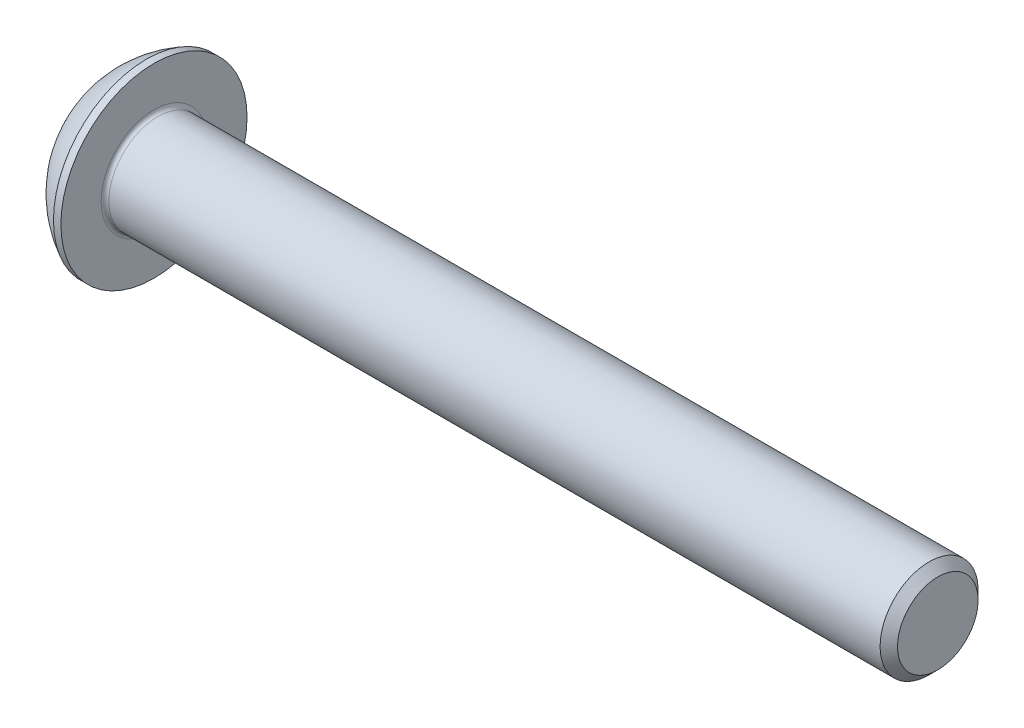
ISO-10303-21;
HEADER;
FILE_DESCRIPTION(('STEP AP214'),'2;1');
FILE_NAME('part.step','',(''),(''),'','','');
FILE_SCHEMA(('AUTOMOTIVE_DESIGN { 1 0 10303 214 1 1 1 1 }'));
ENDSEC;
DATA;
#1=APPLICATION_CONTEXT('core data for automotive mechanical design processes');
#2=APPLICATION_PROTOCOL_DEFINITION('international standard','automotive_design',2000,#1);
#3=PRODUCT_CONTEXT('',#1,'mechanical');
#4=PRODUCT('Part','Part','',(#3));
#5=PRODUCT_RELATED_PRODUCT_CATEGORY('part','',(#4));
#6=PRODUCT_DEFINITION_FORMATION('','',#4);
#7=PRODUCT_DEFINITION_CONTEXT('part definition',#1,'design');
#8=PRODUCT_DEFINITION('design','',#6,#7);
#9=PRODUCT_DEFINITION_SHAPE('','',#8);
#10=(LENGTH_UNIT() NAMED_UNIT(*) SI_UNIT(.MILLI.,.METRE.));
#11=(NAMED_UNIT(*) PLANE_ANGLE_UNIT() SI_UNIT($,.RADIAN.));
#12=(NAMED_UNIT(*) SI_UNIT($,.STERADIAN.) SOLID_ANGLE_UNIT());
#13=UNCERTAINTY_MEASURE_WITH_UNIT(LENGTH_MEASURE(1.E-05),#10,'distance_accuracy_value','');
#14=(GEOMETRIC_REPRESENTATION_CONTEXT(3) GLOBAL_UNCERTAINTY_ASSIGNED_CONTEXT((#13)) GLOBAL_UNIT_ASSIGNED_CONTEXT((#10,
#11,#12)) REPRESENTATION_CONTEXT('',''));
#15=CARTESIAN_POINT('',(0.,0.,0.));
#16=DIRECTION('',(0.,0.,1.));
#17=DIRECTION('',(1.,0.,0.));
#18=AXIS2_PLACEMENT_3D('',#15,#16,#17);
#19=CARTESIAN_POINT('',(0.,0.,0.));
#20=DIRECTION('',(-1.,0.,0.));
#21=DIRECTION('',(0.,0.,1.));
#22=AXIS2_PLACEMENT_3D('',#19,#20,#21);
#23=PLANE('',#22);
#24=CARTESIAN_POINT('',(0.,0.,0.));
#25=DIRECTION('',(-1.,0.,0.));
#26=DIRECTION('',(0.,0.,1.));
#27=AXIS2_PLACEMENT_3D('',#24,#25,#26);
#28=CIRCLE('',#27,2.375);
#29=CARTESIAN_POINT('',(0.,2.375,0.));
#30=VERTEX_POINT('',#29);
#31=EDGE_CURVE('E157',#30,#30,#28,.T.);
#32=ORIENTED_EDGE('',*,*,#31,.T.);
#33=EDGE_LOOP('',(#32));
#34=FACE_BOUND('',#33,.T.);
#35=DIRECTION('',(0.,-1.,0.));
#36=VECTOR('',#35,1.);
#37=CARTESIAN_POINT('',(0.,-0.866025403784438,1.5));
#38=LINE('',#37,#36);
#39=CARTESIAN_POINT('',(0.,0.866025403784439,1.5));
#40=VERTEX_POINT('',#39);
#41=CARTESIAN_POINT('',(0.,-0.866025403784438,1.5));
#42=VERTEX_POINT('',#41);
#43=EDGE_CURVE('E52',#40,#42,#38,.T.);
#44=ORIENTED_EDGE('',*,*,#43,.T.);
#45=DIRECTION('',(0.,-0.500000000000001,-0.866025403784438));
#46=VECTOR('',#45,1.);
#47=CARTESIAN_POINT('',(0.,-1.73205080756888,0.));
#48=LINE('',#47,#46);
#49=CARTESIAN_POINT('',(0.,-1.73205080756888,0.));
#50=VERTEX_POINT('',#49);
#51=EDGE_CURVE('E277',#42,#50,#48,.T.);
#52=ORIENTED_EDGE('',*,*,#51,.T.);
#53=DIRECTION('',(0.,0.500000000000001,-0.866025403784438));
#54=VECTOR('',#53,1.);
#55=CARTESIAN_POINT('',(0.,-0.866025403784438,-1.5));
#56=LINE('',#55,#54);
#57=CARTESIAN_POINT('',(0.,-0.866025403784438,-1.5));
#58=VERTEX_POINT('',#57);
#59=EDGE_CURVE('E132',#50,#58,#56,.T.);
#60=ORIENTED_EDGE('',*,*,#59,.T.);
#61=DIRECTION('',(0.,1.,0.));
#62=VECTOR('',#61,1.);
#63=CARTESIAN_POINT('',(0.,0.866025403784439,-1.5));
#64=LINE('',#63,#62);
#65=CARTESIAN_POINT('',(0.,0.866025403784439,-1.5));
#66=VERTEX_POINT('',#65);
#67=EDGE_CURVE('E280',#58,#66,#64,.T.);
#68=ORIENTED_EDGE('',*,*,#67,.T.);
#69=DIRECTION('',(0.,0.5,0.866025403784439));
#70=VECTOR('',#69,1.);
#71=CARTESIAN_POINT('',(0.,1.73205080756888,0.));
#72=LINE('',#71,#70);
#73=CARTESIAN_POINT('',(0.,1.73205080756888,0.));
#74=VERTEX_POINT('',#73);
#75=EDGE_CURVE('E282',#66,#74,#72,.T.);
#76=ORIENTED_EDGE('',*,*,#75,.T.);
#77=DIRECTION('',(0.,-0.5,0.866025403784439));
#78=VECTOR('',#77,1.);
#79=CARTESIAN_POINT('',(0.,0.866025403784439,1.5));
#80=LINE('',#79,#78);
#81=EDGE_CURVE('E284',#74,#40,#80,.T.);
#82=ORIENTED_EDGE('',*,*,#81,.T.);
#83=EDGE_LOOP('',(#44,#52,#60,#68,#76,#82));
#84=FACE_BOUND('',#83,.T.);
#85=ADVANCED_FACE('F37',(#34,#84),#23,.T.);
#86=CARTESIAN_POINT('',(4.75501582278481,0.,0.));
#87=DIRECTION('',(-1.,0.,0.));
#88=DIRECTION('',(0.,1.,0.));
#89=AXIS2_PLACEMENT_3D('',#86,#87,#88);
#90=SPHERICAL_SURFACE('',#89,5.3151482081814);
#91=CARTESIAN_POINT('',(2.37,0.,0.));
#92=DIRECTION('',(-1.,0.,0.));
#93=DIRECTION('',(0.,0.,1.));
#94=AXIS2_PLACEMENT_3D('',#91,#92,#93);
#95=CIRCLE('',#94,4.75);
#96=CARTESIAN_POINT('',(2.37,4.75,0.));
#97=VERTEX_POINT('',#96);
#98=EDGE_CURVE('E154',#97,#97,#95,.T.);
#99=CARTESIAN_POINT('',(2.37,4.75,0.));
#100=CARTESIAN_POINT('',(2.33822259048669,4.73404434732511,0.));
#101=CARTESIAN_POINT('',(2.30660534291523,4.71776971995817,0.));
#102=CARTESIAN_POINT('',(2.24370380094997,4.68458927158339,0.));
#103=CARTESIAN_POINT('',(2.21241950655618,4.66768345057555,0.));
#104=CARTESIAN_POINT('',(2.15019650024021,4.6332473706621,0.));
#105=CARTESIAN_POINT('',(2.11925778831804,4.6157171117565,0.));
#106=CARTESIAN_POINT('',(2.05773840110808,4.58003923142985,0.));
#107=CARTESIAN_POINT('',(2.02715772582028,4.56189161000879,0.));
#108=CARTESIAN_POINT('',(1.96636673145741,4.52498631044657,0.));
#109=CARTESIAN_POINT('',(1.93615641238234,4.50622863230542,0.));
#110=CARTESIAN_POINT('',(1.87611829826807,4.46811077571318,0.));
#111=CARTESIAN_POINT('',(1.84629050322887,4.4487505972621,0.));
#112=CARTESIAN_POINT('',(1.78702945162455,4.40943553782984,0.));
#113=CARTESIAN_POINT('',(1.75759619505941,4.38948065684866,0.));
#114=CARTESIAN_POINT('',(1.69913607574061,4.34898423002648,0.));
#115=CARTESIAN_POINT('',(1.67010921298694,4.32844268418549,0.));
#116=CARTESIAN_POINT('',(1.61247357298735,4.28678120152175,0.));
#117=CARTESIAN_POINT('',(1.58386479574144,4.265661264699,0.));
#118=CARTESIAN_POINT('',(1.52707685004032,4.22285150694424,0.));
#119=CARTESIAN_POINT('',(1.49889768158512,4.20116168601223,0.));
#120=CARTESIAN_POINT('',(1.44298030371049,4.15722089644741,0.));
#121=CARTESIAN_POINT('',(1.41524209429107,4.13496992781461,0.));
#122=CARTESIAN_POINT('',(1.36021780711889,4.08991580528235,0.));
#123=CARTESIAN_POINT('',(1.33293172936613,4.06711265138288,0.));
#124=CARTESIAN_POINT('',(1.278822696045,4.02096334316478,0.));
#125=CARTESIAN_POINT('',(1.25199974047662,3.99761718884614,0.));
#126=CARTESIAN_POINT('',(1.19882775550162,3.95039128335163,0.));
#127=CARTESIAN_POINT('',(1.172478726095,3.92651153217576,0.));
#128=CARTESIAN_POINT('',(1.1202652065289,3.87822805145535,0.));
#129=CARTESIAN_POINT('',(1.09440071636942,3.85382432191081,0.));
#130=CARTESIAN_POINT('',(1.04316669321618,3.8045027139941,0.));
#131=CARTESIAN_POINT('',(1.01779716022241,3.77958483562192,0.));
#132=CARTESIAN_POINT('',(0.9675632699561,3.72924496668416,0.));
#133=CARTESIAN_POINT('',(0.942698912683562,3.70382297611859,0.));
#134=CARTESIAN_POINT('',(0.893485388936279,3.65248512247887,0.));
#135=CARTESIAN_POINT('',(0.869136222461535,3.62656925940472,0.));
#136=CARTESIAN_POINT('',(0.820962887873489,3.57425409935885,0.));
#137=CARTESIAN_POINT('',(0.797138719760188,3.54785480238711,0.));
#138=CARTESIAN_POINT('',(0.750024977995378,3.49458340787865,0.));
#139=CARTESIAN_POINT('',(0.726735404343869,3.46771131034191,0.));
#140=CARTESIAN_POINT('',(0.68070023227454,3.41350513847464,0.));
#141=CARTESIAN_POINT('',(0.657954633856721,3.3861710641441,0.));
#142=CARTESIAN_POINT('',(0.613016573919582,3.33105194853939,0.));
#143=CARTESIAN_POINT('',(0.590824112400263,3.30326690726522,0.));
#144=CARTESIAN_POINT('',(0.547001265128254,3.24725704926748,0.));
#145=CARTESIAN_POINT('',(0.525370879375564,3.21903223254391,0.));
#146=CARTESIAN_POINT('',(0.482680896105488,3.16215419227902,0.));
#147=CARTESIAN_POINT('',(0.461621298588104,3.13350096873769,0.));
#148=CARTESIAN_POINT('',(0.420081374357153,3.07577765602273,0.));
#149=CARTESIAN_POINT('',(0.399601047643587,3.04670756684908,0.));
#150=CARTESIAN_POINT('',(0.359227914239947,2.98816223197683,0.));
#151=CARTESIAN_POINT('',(0.339335107549873,2.95868698627822,0.));
#152=CARTESIAN_POINT('',(0.300145026860787,2.89934321060632,0.));
#153=CARTESIAN_POINT('',(0.280847752861776,2.86947468063304,0.));
#154=CARTESIAN_POINT('',(0.24285650999714,2.80935636725696,0.));
#155=CARTESIAN_POINT('',(0.224162541131515,2.77910658385417,0.));
#156=CARTESIAN_POINT('',(0.187385439283607,2.71823794734018,0.));
#157=CARTESIAN_POINT('',(0.169302306301324,2.68761909422898,0.));
#158=CARTESIAN_POINT('',(0.133754156035988,2.626024653246,0.));
#159=CARTESIAN_POINT('',(0.116289138752934,2.59504906537422,0.));
#160=CARTESIAN_POINT('',(0.081984269005742,2.53275362391635,0.));
#161=CARTESIAN_POINT('',(0.0651444165416036,2.50143377033028,0.));
#162=CARTESIAN_POINT('',(0.0320966055444289,2.43846244094735,0.));
#163=CARTESIAN_POINT('',(0.0158886470113927,2.40681096515049,0.));
#164=CARTESIAN_POINT('',(0.,2.375,0.));
#165=B_SPLINE_CURVE_WITH_KNOTS('',3,(#99,#100,#101,#102,#103,#104,#105,#106,#107,#108,#109,#110,
#111,#112,#113,#114,#115,#116,#117,#118,#119,#120,#121,#122,#123,#124,#125,#126,#127,#128,#129,
#130,#131,#132,#133,#134,#135,#136,#137,#138,#139,#140,#141,#142,#143,#144,#145,#146,#147,#148,
#149,#150,#151,#152,#153,#154,#155,#156,#157,#158,#159,#160,#161,#162,#163,#164),.UNSPECIFIED.,
.F.,.F.,(4,2,2,2,2,2,2,2,2,2,2,2,2,2,2,2,2,2,2,2,2,2,2,2,2,2,2,2,2,2,2,2,4),(0.,
0.106672849678272,0.213345699356545,0.320018549034817,0.42669139871309,0.533364248391363,
0.640037098069635,0.746709947747908,0.85338279742618,0.960055647104452,1.06672849678273,
1.173401346461,1.28007419613927,1.38674704581754,1.49341989549582,1.60009274517409,
1.70676559485236,1.81343844453063,1.9201112942089,2.02678414388718,2.13345699356545,
2.24012984324372,2.346802692922,2.45347554260027,2.56014839227854,2.66682124195681,
2.77349409163509,2.88016694131336,2.98683979099163,3.0935126406699,3.20018549034817,
3.30685834002645,3.41353118970472),.UNSPECIFIED.);
#166=EDGE_CURVE('BSEAM178',#97,#30,#165,.T.);
#167=ORIENTED_EDGE('',*,*,#98,.T.);
#168=ORIENTED_EDGE('',*,*,#31,.F.);
#169=ORIENTED_EDGE('',*,*,#166,.T.);
#170=ORIENTED_EDGE('',*,*,#166,.F.);
#171=EDGE_LOOP('',(#167,#169,#168,#170));
#172=FACE_BOUND('',#171,.T.);
#173=ADVANCED_FACE('F178',(#172),#90,.T.);
#174=CARTESIAN_POINT('',(0.,0.,0.));
#175=DIRECTION('',(-1.,0.,0.));
#176=DIRECTION('',(0.,0.,1.));
#177=AXIS2_PLACEMENT_3D('',#174,#175,#176);
#178=CYLINDRICAL_SURFACE('',#177,4.75);
#179=ORIENTED_EDGE('',*,*,#98,.F.);
#180=EDGE_LOOP('',(#179));
#181=FACE_BOUND('',#180,.T.);
#182=CARTESIAN_POINT('',(2.75,0.,0.));
#183=DIRECTION('',(-1.,0.,0.));
#184=DIRECTION('',(0.,0.,1.));
#185=AXIS2_PLACEMENT_3D('',#182,#183,#184);
#186=CIRCLE('',#185,4.75);
#187=CARTESIAN_POINT('',(2.75,0.,4.75));
#188=VERTEX_POINT('',#187);
#189=EDGE_CURVE('E151',#188,#188,#186,.T.);
#190=ORIENTED_EDGE('',*,*,#189,.T.);
#191=EDGE_LOOP('',(#190));
#192=FACE_BOUND('',#191,.T.);
#193=ADVANCED_FACE('F183',(#181,#192),#178,.T.);
#194=CARTESIAN_POINT('',(2.75,2.5,0.));
#195=DIRECTION('',(-1.,0.,0.));
#196=DIRECTION('',(0.,0.,1.));
#197=AXIS2_PLACEMENT_3D('',#194,#195,#196);
#198=PLANE('',#197);
#199=CARTESIAN_POINT('',(2.75,0.,0.));
#200=DIRECTION('',(-1.,0.,0.));
#201=DIRECTION('',(0.,0.,1.));
#202=AXIS2_PLACEMENT_3D('',#199,#200,#201);
#203=CIRCLE('',#202,2.7);
#204=CARTESIAN_POINT('',(2.75,0.,2.7));
#205=VERTEX_POINT('',#204);
#206=EDGE_CURVE('E45',#205,#205,#203,.T.);
#207=ORIENTED_EDGE('',*,*,#206,.T.);
#208=EDGE_LOOP('',(#207));
#209=FACE_BOUND('',#208,.T.);
#210=ORIENTED_EDGE('',*,*,#189,.F.);
#211=EDGE_LOOP('',(#210));
#212=FACE_BOUND('',#211,.T.);
#213=ADVANCED_FACE('F162',(#209,#212),#198,.F.);
#214=CARTESIAN_POINT('',(0.,0.,0.));
#215=DIRECTION('',(-1.,0.,0.));
#216=DIRECTION('',(0.,0.,1.));
#217=AXIS2_PLACEMENT_3D('',#214,#215,#216);
#218=CYLINDRICAL_SURFACE('',#217,2.5);
#219=CARTESIAN_POINT('',(2.95,0.,0.));
#220=DIRECTION('',(-1.,0.,0.));
#221=DIRECTION('',(0.,0.,1.));
#222=AXIS2_PLACEMENT_3D('',#219,#220,#221);
#223=CIRCLE('',#222,2.5);
#224=CARTESIAN_POINT('',(2.95,0.,2.5));
#225=VERTEX_POINT('',#224);
#226=EDGE_CURVE('E11',#225,#225,#223,.F.);
#227=ORIENTED_EDGE('',*,*,#226,.T.);
#228=EDGE_LOOP('',(#227));
#229=FACE_BOUND('',#228,.T.);
#230=CARTESIAN_POINT('',(42.305,0.,0.));
#231=DIRECTION('',(-1.,0.,0.));
#232=DIRECTION('',(0.,0.,1.));
#233=AXIS2_PLACEMENT_3D('',#230,#231,#232);
#234=CIRCLE('',#233,2.5);
#235=CARTESIAN_POINT('',(42.305,0.,2.5));
#236=VERTEX_POINT('',#235);
#237=EDGE_CURVE('E148',#236,#236,#234,.T.);
#238=ORIENTED_EDGE('',*,*,#237,.T.);
#239=EDGE_LOOP('',(#238));
#240=FACE_BOUND('',#239,.T.);
#241=ADVANCED_FACE('F192',(#229,#240),#218,.T.);
#242=CARTESIAN_POINT('',(42.75,0.,0.));
#243=DIRECTION('',(-1.,0.,0.));
#244=DIRECTION('',(0.,0.,1.));
#245=AXIS2_PLACEMENT_3D('',#242,#243,#244);
#246=CONICAL_SURFACE('',#245,2.055,0.785398163397441);
#247=ORIENTED_EDGE('',*,*,#237,.F.);
#248=EDGE_LOOP('',(#247));
#249=FACE_BOUND('',#248,.T.);
#250=CARTESIAN_POINT('',(42.75,0.,0.));
#251=DIRECTION('',(-1.,0.,0.));
#252=DIRECTION('',(0.,0.,1.));
#253=AXIS2_PLACEMENT_3D('',#250,#251,#252);
#254=CIRCLE('',#253,2.055);
#255=CARTESIAN_POINT('',(42.75,0.,2.055));
#256=VERTEX_POINT('',#255);
#257=EDGE_CURVE('E144',#256,#256,#254,.T.);
#258=ORIENTED_EDGE('',*,*,#257,.T.);
#259=EDGE_LOOP('',(#258));
#260=FACE_BOUND('',#259,.T.);
#261=ADVANCED_FACE('F173',(#249,#260),#246,.T.);
#262=CARTESIAN_POINT('',(42.75,0.,0.));
#263=DIRECTION('',(-1.,0.,0.));
#264=DIRECTION('',(0.,0.,1.));
#265=AXIS2_PLACEMENT_3D('',#262,#263,#264);
#266=PLANE('',#265);
#267=ORIENTED_EDGE('',*,*,#257,.F.);
#268=EDGE_LOOP('',(#267));
#269=FACE_BOUND('',#268,.T.);
#270=ADVANCED_FACE('F166',(#269),#266,.F.);
#271=CARTESIAN_POINT('',(2.95,0.,0.));
#272=DIRECTION('',(-1.,0.,0.));
#273=DIRECTION('',(0.,0.,1.));
#274=AXIS2_PLACEMENT_3D('',#271,#272,#273);
#275=TOROIDAL_SURFACE('',#274,2.7,0.2);
#276=ORIENTED_EDGE('',*,*,#226,.F.);
#277=EDGE_LOOP('',(#276));
#278=FACE_BOUND('',#277,.T.);
#279=ORIENTED_EDGE('',*,*,#206,.F.);
#280=EDGE_LOOP('',(#279));
#281=FACE_BOUND('',#280,.T.);
#282=ADVANCED_FACE('F39',(#278,#281),#275,.F.);
#283=CARTESIAN_POINT('',(1.56,-1.73205080756888,0.));
#284=DIRECTION('',(0.,0.866025403784438,-0.500000000000001));
#285=DIRECTION('',(0.,0.500000000000001,0.866025403784438));
#286=AXIS2_PLACEMENT_3D('',#283,#284,#285);
#287=PLANE('',#286);
#288=DIRECTION('',(0.,-0.500000000000001,-0.866025403784438));
#289=VECTOR('',#288,1.);
#290=CARTESIAN_POINT('',(1.56,-1.73205080756888,0.));
#291=LINE('',#290,#289);
#292=CARTESIAN_POINT('',(1.56,-0.866025403784438,1.5));
#293=VERTEX_POINT('',#292);
#294=CARTESIAN_POINT('',(1.56,-1.29903810567666,0.750000000000002));
#295=VERTEX_POINT('',#294);
#296=EDGE_CURVE('E118',#293,#295,#291,.T.);
#297=ORIENTED_EDGE('',*,*,#296,.T.);
#298=CARTESIAN_POINT('',(1.56,-1.73205080756888,0.));
#299=VERTEX_POINT('',#298);
#300=EDGE_CURVE('E113',#295,#299,#291,.T.);
#301=ORIENTED_EDGE('',*,*,#300,.T.);
#302=DIRECTION('',(-1.,0.,0.));
#303=VECTOR('',#302,1.);
#304=CARTESIAN_POINT('',(1.56,-1.73205080756888,0.));
#305=LINE('',#304,#303);
#306=EDGE_CURVE('E115',#299,#50,#305,.T.);
#307=ORIENTED_EDGE('',*,*,#306,.T.);
#308=ORIENTED_EDGE('',*,*,#51,.F.);
#309=DIRECTION('',(-1.,0.,0.));
#310=VECTOR('',#309,1.);
#311=CARTESIAN_POINT('',(1.56,-0.866025403784438,1.5));
#312=LINE('',#311,#310);
#313=EDGE_CURVE('E273',#293,#42,#312,.T.);
#314=ORIENTED_EDGE('',*,*,#313,.F.);
#315=EDGE_LOOP('',(#297,#301,#307,#308,#314));
#316=FACE_BOUND('',#315,.T.);
#317=ADVANCED_FACE('F114',(#316),#287,.T.);
#318=CARTESIAN_POINT('',(1.56,-0.866025403784438,-1.5));
#319=DIRECTION('',(0.,0.866025403784438,0.500000000000001));
#320=DIRECTION('',(0.,-0.500000000000001,0.866025403784438));
#321=AXIS2_PLACEMENT_3D('',#318,#319,#320);
#322=PLANE('',#321);
#323=DIRECTION('',(0.,0.500000000000001,-0.866025403784438));
#324=VECTOR('',#323,1.);
#325=CARTESIAN_POINT('',(1.56,-0.866025403784438,-1.5));
#326=LINE('',#325,#324);
#327=CARTESIAN_POINT('',(1.56,-1.29903810567666,-0.750000000000001));
#328=VERTEX_POINT('',#327);
#329=EDGE_CURVE('E60',#299,#328,#326,.T.);
#330=ORIENTED_EDGE('',*,*,#329,.T.);
#331=CARTESIAN_POINT('',(1.56,-0.866025403784438,-1.5));
#332=VERTEX_POINT('',#331);
#333=EDGE_CURVE('E127',#328,#332,#326,.T.);
#334=ORIENTED_EDGE('',*,*,#333,.T.);
#335=DIRECTION('',(-1.,0.,0.));
#336=VECTOR('',#335,1.);
#337=CARTESIAN_POINT('',(1.56,-0.866025403784438,-1.5));
#338=LINE('',#337,#336);
#339=EDGE_CURVE('E134',#332,#58,#338,.T.);
#340=ORIENTED_EDGE('',*,*,#339,.T.);
#341=ORIENTED_EDGE('',*,*,#59,.F.);
#342=ORIENTED_EDGE('',*,*,#306,.F.);
#343=EDGE_LOOP('',(#330,#334,#340,#341,#342));
#344=FACE_BOUND('',#343,.T.);
#345=ADVANCED_FACE('F130',(#344),#322,.T.);
#346=CARTESIAN_POINT('',(1.56,0.866025403784439,-1.5));
#347=DIRECTION('',(0.,0.,1.));
#348=DIRECTION('',(1.,0.,0.));
#349=AXIS2_PLACEMENT_3D('',#346,#347,#348);
#350=PLANE('',#349);
#351=DIRECTION('',(0.,1.,0.));
#352=VECTOR('',#351,1.);
#353=CARTESIAN_POINT('',(1.56,0.866025403784439,-1.5));
#354=LINE('',#353,#352);
#355=CARTESIAN_POINT('',(1.56,0.,-1.5));
#356=VERTEX_POINT('',#355);
#357=EDGE_CURVE('E254',#332,#356,#354,.T.);
#358=ORIENTED_EDGE('',*,*,#357,.T.);
#359=CARTESIAN_POINT('',(1.56,0.866025403784439,-1.5));
#360=VERTEX_POINT('',#359);
#361=EDGE_CURVE('E126',#356,#360,#354,.T.);
#362=ORIENTED_EDGE('',*,*,#361,.T.);
#363=DIRECTION('',(-1.,0.,0.));
#364=VECTOR('',#363,1.);
#365=CARTESIAN_POINT('',(1.56,0.866025403784439,-1.5));
#366=LINE('',#365,#364);
#367=EDGE_CURVE('E139',#360,#66,#366,.T.);
#368=ORIENTED_EDGE('',*,*,#367,.T.);
#369=ORIENTED_EDGE('',*,*,#67,.F.);
#370=ORIENTED_EDGE('',*,*,#339,.F.);
#371=EDGE_LOOP('',(#358,#362,#368,#369,#370));
#372=FACE_BOUND('',#371,.T.);
#373=ADVANCED_FACE('F206',(#372),#350,.T.);
#374=CARTESIAN_POINT('',(1.56,1.73205080756888,0.));
#375=DIRECTION('',(0.,-0.866025403784439,0.5));
#376=DIRECTION('',(0.,-0.5,-0.866025403784439));
#377=AXIS2_PLACEMENT_3D('',#374,#375,#376);
#378=PLANE('',#377);
#379=DIRECTION('',(0.,0.5,0.866025403784439));
#380=VECTOR('',#379,1.);
#381=CARTESIAN_POINT('',(1.56,1.73205080756888,0.));
#382=LINE('',#381,#380);
#383=CARTESIAN_POINT('',(1.56,1.29903810567666,-0.75));
#384=VERTEX_POINT('',#383);
#385=EDGE_CURVE('E243',#360,#384,#382,.T.);
#386=ORIENTED_EDGE('',*,*,#385,.T.);
#387=CARTESIAN_POINT('',(1.56,1.73205080756888,0.));
#388=VERTEX_POINT('',#387);
#389=EDGE_CURVE('E248',#384,#388,#382,.T.);
#390=ORIENTED_EDGE('',*,*,#389,.T.);
#391=DIRECTION('',(-1.,0.,0.));
#392=VECTOR('',#391,1.);
#393=CARTESIAN_POINT('',(1.56,1.73205080756888,0.));
#394=LINE('',#393,#392);
#395=EDGE_CURVE('E288',#388,#74,#394,.T.);
#396=ORIENTED_EDGE('',*,*,#395,.T.);
#397=ORIENTED_EDGE('',*,*,#75,.F.);
#398=ORIENTED_EDGE('',*,*,#367,.F.);
#399=EDGE_LOOP('',(#386,#390,#396,#397,#398));
#400=FACE_BOUND('',#399,.T.);
#401=ADVANCED_FACE('F209',(#400),#378,.T.);
#402=CARTESIAN_POINT('',(1.56,0.866025403784439,1.5));
#403=DIRECTION('',(0.,-0.866025403784439,-0.5));
#404=DIRECTION('',(0.,0.5,-0.866025403784439));
#405=AXIS2_PLACEMENT_3D('',#402,#403,#404);
#406=PLANE('',#405);
#407=DIRECTION('',(0.,-0.5,0.866025403784439));
#408=VECTOR('',#407,1.);
#409=CARTESIAN_POINT('',(1.56,0.866025403784439,1.5));
#410=LINE('',#409,#408);
#411=CARTESIAN_POINT('',(1.56,1.29903810567666,0.75));
#412=VERTEX_POINT('',#411);
#413=EDGE_CURVE('E251',#388,#412,#410,.T.);
#414=ORIENTED_EDGE('',*,*,#413,.T.);
#415=CARTESIAN_POINT('',(1.56,0.866025403784439,1.5));
#416=VERTEX_POINT('',#415);
#417=EDGE_CURVE('E259',#412,#416,#410,.T.);
#418=ORIENTED_EDGE('',*,*,#417,.T.);
#419=DIRECTION('',(-1.,0.,0.));
#420=VECTOR('',#419,1.);
#421=CARTESIAN_POINT('',(1.56,0.866025403784439,1.5));
#422=LINE('',#421,#420);
#423=EDGE_CURVE('E272',#416,#40,#422,.T.);
#424=ORIENTED_EDGE('',*,*,#423,.T.);
#425=ORIENTED_EDGE('',*,*,#81,.F.);
#426=ORIENTED_EDGE('',*,*,#395,.F.);
#427=EDGE_LOOP('',(#414,#418,#424,#425,#426));
#428=FACE_BOUND('',#427,.T.);
#429=ADVANCED_FACE('F213',(#428),#406,.T.);
#430=CARTESIAN_POINT('',(1.56,-0.866025403784438,1.5));
#431=DIRECTION('',(0.,0.,-1.));
#432=DIRECTION('',(-1.,0.,0.));
#433=AXIS2_PLACEMENT_3D('',#430,#431,#432);
#434=PLANE('',#433);
#435=DIRECTION('',(0.,-1.,0.));
#436=VECTOR('',#435,1.);
#437=CARTESIAN_POINT('',(1.56,-0.866025403784438,1.5));
#438=LINE('',#437,#436);
#439=CARTESIAN_POINT('',(1.56,0.,1.5));
#440=VERTEX_POINT('',#439);
#441=EDGE_CURVE('E265',#416,#440,#438,.T.);
#442=ORIENTED_EDGE('',*,*,#441,.T.);
#443=EDGE_CURVE('E267',#440,#293,#438,.T.);
#444=ORIENTED_EDGE('',*,*,#443,.T.);
#445=ORIENTED_EDGE('',*,*,#313,.T.);
#446=ORIENTED_EDGE('',*,*,#43,.F.);
#447=ORIENTED_EDGE('',*,*,#423,.F.);
#448=EDGE_LOOP('',(#442,#444,#445,#446,#447));
#449=FACE_BOUND('',#448,.T.);
#450=ADVANCED_FACE('F217',(#449),#434,.T.);
#451=CARTESIAN_POINT('',(1.56,-1.73205080756888,0.));
#452=DIRECTION('',(1.,0.,0.));
#453=DIRECTION('',(0.,0.,-1.));
#454=AXIS2_PLACEMENT_3D('',#451,#452,#453);
#455=PLANE('',#454);
#456=CARTESIAN_POINT('',(1.56,0.,0.));
#457=DIRECTION('',(-1.,0.,0.));
#458=DIRECTION('',(0.,0.,1.));
#459=AXIS2_PLACEMENT_3D('',#456,#457,#458);
#460=CIRCLE('',#459,1.5);
#461=EDGE_CURVE('E240',#384,#356,#460,.T.);
#462=ORIENTED_EDGE('',*,*,#461,.F.);
#463=ORIENTED_EDGE('',*,*,#385,.F.);
#464=ORIENTED_EDGE('',*,*,#361,.F.);
#465=EDGE_LOOP('',(#462,#463,#464));
#466=FACE_BOUND('',#465,.T.);
#467=ADVANCED_FACE('F221',(#466),#455,.F.);
#468=EDGE_CURVE('E145',#412,#384,#460,.T.);
#469=ORIENTED_EDGE('',*,*,#468,.F.);
#470=ORIENTED_EDGE('',*,*,#413,.F.);
#471=ORIENTED_EDGE('',*,*,#389,.F.);
#472=EDGE_LOOP('',(#469,#470,#471));
#473=FACE_BOUND('',#472,.T.);
#474=ADVANCED_FACE('F230',(#473),#455,.F.);
#475=EDGE_CURVE('E138',#440,#412,#460,.T.);
#476=ORIENTED_EDGE('',*,*,#475,.F.);
#477=ORIENTED_EDGE('',*,*,#441,.F.);
#478=ORIENTED_EDGE('',*,*,#417,.F.);
#479=EDGE_LOOP('',(#476,#477,#478));
#480=FACE_BOUND('',#479,.T.);
#481=ADVANCED_FACE('F235',(#480),#455,.F.);
#482=EDGE_CURVE('E133',#295,#440,#460,.T.);
#483=ORIENTED_EDGE('',*,*,#482,.F.);
#484=ORIENTED_EDGE('',*,*,#296,.F.);
#485=ORIENTED_EDGE('',*,*,#443,.F.);
#486=EDGE_LOOP('',(#483,#484,#485));
#487=FACE_BOUND('',#486,.T.);
#488=ADVANCED_FACE('F228',(#487),#455,.F.);
#489=EDGE_CURVE('E124',#328,#295,#460,.T.);
#490=ORIENTED_EDGE('',*,*,#489,.F.);
#491=ORIENTED_EDGE('',*,*,#329,.F.);
#492=ORIENTED_EDGE('',*,*,#300,.F.);
#493=EDGE_LOOP('',(#490,#491,#492));
#494=FACE_BOUND('',#493,.T.);
#495=ADVANCED_FACE('F123',(#494),#455,.F.);
#496=EDGE_CURVE('E246',#356,#328,#460,.T.);
#497=ORIENTED_EDGE('',*,*,#496,.F.);
#498=ORIENTED_EDGE('',*,*,#357,.F.);
#499=ORIENTED_EDGE('',*,*,#333,.F.);
#500=EDGE_LOOP('',(#497,#498,#499));
#501=FACE_BOUND('',#500,.T.);
#502=ADVANCED_FACE('F201',(#501),#455,.F.);
#503=CARTESIAN_POINT('',(2.42602540378445,0.,0.));
#504=DIRECTION('',(-1.,0.,0.));
#505=DIRECTION('',(0.,0.,1.));
#506=AXIS2_PLACEMENT_3D('',#503,#504,#505);
#507=CONICAL_SURFACE('',#506,0.,1.04719755119659);
#508=ORIENTED_EDGE('',*,*,#475,.T.);
#509=ORIENTED_EDGE('',*,*,#468,.T.);
#510=ORIENTED_EDGE('',*,*,#461,.T.);
#511=ORIENTED_EDGE('',*,*,#496,.T.);
#512=ORIENTED_EDGE('',*,*,#489,.T.);
#513=ORIENTED_EDGE('',*,*,#482,.T.);
#514=EDGE_LOOP('',(#508,#509,#510,#511,#512,#513));
#515=FACE_BOUND('',#514,.T.);
#516=CARTESIAN_POINT('',(2.42602540378445,0.,0.));
#517=VERTEX_POINT('',#516);
#518=VERTEX_LOOP('',#517);
#519=FACE_BOUND('',#518,.T.);
#520=ADVANCED_FACE('F199',(#515,#519),#507,.F.);
#521=CLOSED_SHELL('',(#85,#173,#193,#213,#241,#261,#270,#282,#317,#345,#373,#401,#429,#450,#467,
#474,#481,#488,#495,#502,#520));
#522=MANIFOLD_SOLID_BREP('B2',#521);
#523=ADVANCED_BREP_SHAPE_REPRESENTATION('',(#18,#522),#14);
#524=SHAPE_DEFINITION_REPRESENTATION(#9,#523);
ENDSEC;
END-ISO-10303-21;
